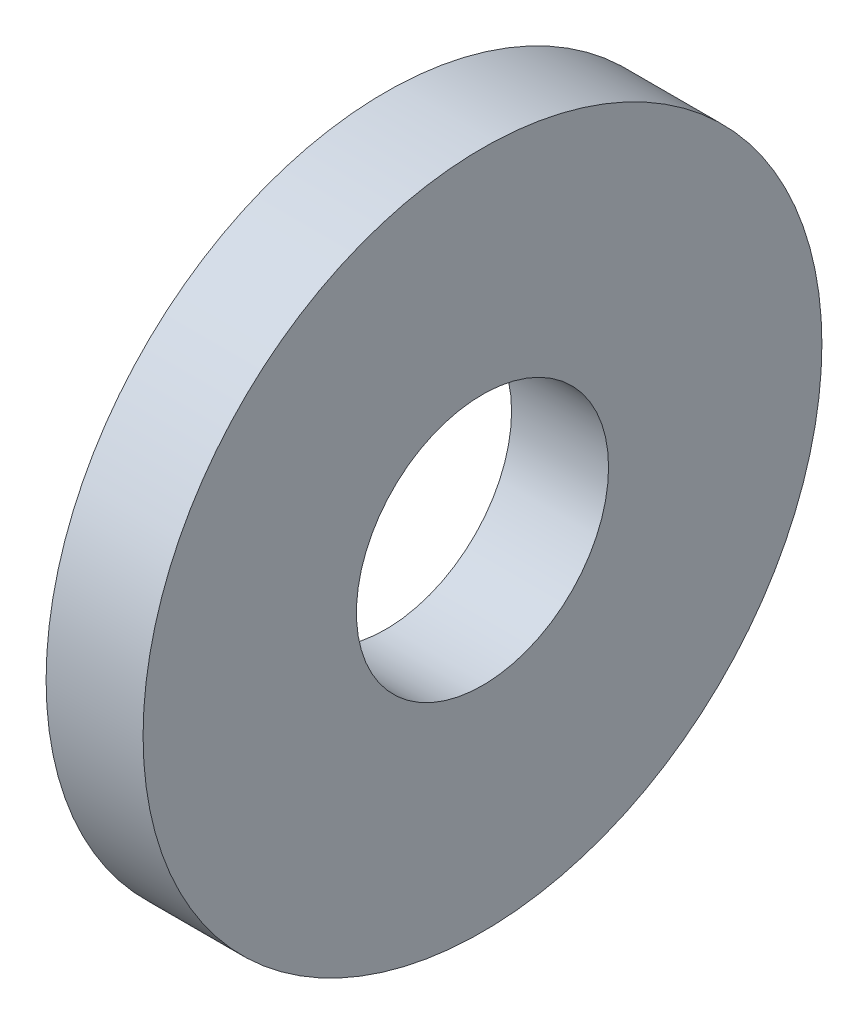
ISO-10303-21;
HEADER;
FILE_DESCRIPTION(('STEP AP214'),'2;1');
FILE_NAME('part.step','',(''),(''),'','','');
FILE_SCHEMA(('AUTOMOTIVE_DESIGN { 1 0 10303 214 1 1 1 1 }'));
ENDSEC;
DATA;
#1=APPLICATION_CONTEXT('core data for automotive mechanical design processes');
#2=APPLICATION_PROTOCOL_DEFINITION('international standard','automotive_design',2000,#1);
#3=PRODUCT_CONTEXT('',#1,'mechanical');
#4=PRODUCT('Part','Part','',(#3));
#5=PRODUCT_RELATED_PRODUCT_CATEGORY('part','',(#4));
#6=PRODUCT_DEFINITION_FORMATION('','',#4);
#7=PRODUCT_DEFINITION_CONTEXT('part definition',#1,'design');
#8=PRODUCT_DEFINITION('design','',#6,#7);
#9=PRODUCT_DEFINITION_SHAPE('','',#8);
#10=(LENGTH_UNIT() NAMED_UNIT(*) SI_UNIT(.MILLI.,.METRE.));
#11=(NAMED_UNIT(*) PLANE_ANGLE_UNIT() SI_UNIT($,.RADIAN.));
#12=(NAMED_UNIT(*) SI_UNIT($,.STERADIAN.) SOLID_ANGLE_UNIT());
#13=UNCERTAINTY_MEASURE_WITH_UNIT(LENGTH_MEASURE(1.E-05),#10,'distance_accuracy_value','');
#14=(GEOMETRIC_REPRESENTATION_CONTEXT(3) GLOBAL_UNCERTAINTY_ASSIGNED_CONTEXT((#13)) GLOBAL_UNIT_ASSIGNED_CONTEXT((#10,
#11,#12)) REPRESENTATION_CONTEXT('',''));
#15=CARTESIAN_POINT('',(0.,0.,0.));
#16=DIRECTION('',(0.,0.,1.));
#17=DIRECTION('',(1.,0.,0.));
#18=AXIS2_PLACEMENT_3D('',#15,#16,#17);
#19=CARTESIAN_POINT('',(5.,-0.860574948665288,-0.573716632443544));
#20=DIRECTION('',(1.,0.,0.));
#21=DIRECTION('',(0.,0.,-1.));
#22=AXIS2_PLACEMENT_3D('',#19,#20,#21);
#23=PLANE('',#22);
#24=CARTESIAN_POINT('',(5.,-0.860574948665288,-0.573716632443544));
#25=DIRECTION('',(1.,0.,0.));
#26=DIRECTION('',(0.,0.,-1.));
#27=AXIS2_PLACEMENT_3D('',#24,#25,#26);
#28=CIRCLE('',#27,17.5);
#29=CARTESIAN_POINT('',(5.,-0.860574948665288,-18.0737166324435));
#30=VERTEX_POINT('',#29);
#31=EDGE_CURVE('E10',#30,#30,#28,.T.);
#32=ORIENTED_EDGE('',*,*,#31,.T.);
#33=EDGE_LOOP('',(#32));
#34=FACE_BOUND('',#33,.T.);
#35=CARTESIAN_POINT('',(5.,-0.860574948665288,-0.573716632443544));
#36=DIRECTION('',(1.,0.,0.));
#37=DIRECTION('',(0.,0.,-1.));
#38=AXIS2_PLACEMENT_3D('',#35,#36,#37);
#39=CIRCLE('',#38,6.5);
#40=CARTESIAN_POINT('',(5.,-0.860574948665288,-7.07371663244354));
#41=VERTEX_POINT('',#40);
#42=EDGE_CURVE('E41',#41,#41,#39,.T.);
#43=ORIENTED_EDGE('',*,*,#42,.F.);
#44=EDGE_LOOP('',(#43));
#45=FACE_BOUND('',#44,.T.);
#46=ADVANCED_FACE('F30',(#34,#45),#23,.T.);
#47=CARTESIAN_POINT('',(0.,-0.860574948665288,-0.573716632443544));
#48=DIRECTION('',(1.,0.,0.));
#49=DIRECTION('',(0.,0.,-1.));
#50=AXIS2_PLACEMENT_3D('',#47,#48,#49);
#51=PLANE('',#50);
#52=CARTESIAN_POINT('',(0.,-0.860574948665288,-0.573716632443544));
#53=DIRECTION('',(1.,0.,0.));
#54=DIRECTION('',(0.,0.,-1.));
#55=AXIS2_PLACEMENT_3D('',#52,#53,#54);
#56=CIRCLE('',#55,17.5);
#57=CARTESIAN_POINT('',(0.,-0.860574948665288,-18.0737166324435));
#58=VERTEX_POINT('',#57);
#59=EDGE_CURVE('E34',#58,#58,#56,.T.);
#60=ORIENTED_EDGE('',*,*,#59,.F.);
#61=EDGE_LOOP('',(#60));
#62=FACE_BOUND('',#61,.T.);
#63=CARTESIAN_POINT('',(0.,-0.860574948665288,-0.573716632443544));
#64=DIRECTION('',(1.,0.,0.));
#65=DIRECTION('',(0.,0.,-1.));
#66=AXIS2_PLACEMENT_3D('',#63,#64,#65);
#67=CIRCLE('',#66,6.5);
#68=CARTESIAN_POINT('',(0.,-0.860574948665288,-7.07371663244354));
#69=VERTEX_POINT('',#68);
#70=EDGE_CURVE('E43',#69,#69,#67,.T.);
#71=ORIENTED_EDGE('',*,*,#70,.T.);
#72=EDGE_LOOP('',(#71));
#73=FACE_BOUND('',#72,.T.);
#74=ADVANCED_FACE('F53',(#62,#73),#51,.F.);
#75=CARTESIAN_POINT('',(5.,-0.860574948665288,-0.573716632443544));
#76=DIRECTION('',(-1.,0.,0.));
#77=DIRECTION('',(0.,0.,1.));
#78=AXIS2_PLACEMENT_3D('',#75,#76,#77);
#79=CYLINDRICAL_SURFACE('',#78,17.5);
#80=ORIENTED_EDGE('',*,*,#31,.F.);
#81=EDGE_LOOP('',(#80));
#82=FACE_BOUND('',#81,.T.);
#83=ORIENTED_EDGE('',*,*,#59,.T.);
#84=EDGE_LOOP('',(#83));
#85=FACE_BOUND('',#84,.T.);
#86=ADVANCED_FACE('F32',(#82,#85),#79,.T.);
#87=CARTESIAN_POINT('',(5.,-0.860574948665288,-0.573716632443544));
#88=DIRECTION('',(-1.,0.,0.));
#89=DIRECTION('',(0.,0.,1.));
#90=AXIS2_PLACEMENT_3D('',#87,#88,#89);
#91=CYLINDRICAL_SURFACE('',#90,6.5);
#92=ORIENTED_EDGE('',*,*,#42,.T.);
#93=EDGE_LOOP('',(#92));
#94=FACE_BOUND('',#93,.T.);
#95=ORIENTED_EDGE('',*,*,#70,.F.);
#96=EDGE_LOOP('',(#95));
#97=FACE_BOUND('',#96,.T.);
#98=ADVANCED_FACE('F49',(#94,#97),#91,.F.);
#99=CLOSED_SHELL('',(#46,#74,#86,#98));
#100=MANIFOLD_SOLID_BREP('B2',#99);
#101=ADVANCED_BREP_SHAPE_REPRESENTATION('',(#18,#100),#14);
#102=SHAPE_DEFINITION_REPRESENTATION(#9,#101);
ENDSEC;
END-ISO-10303-21;
